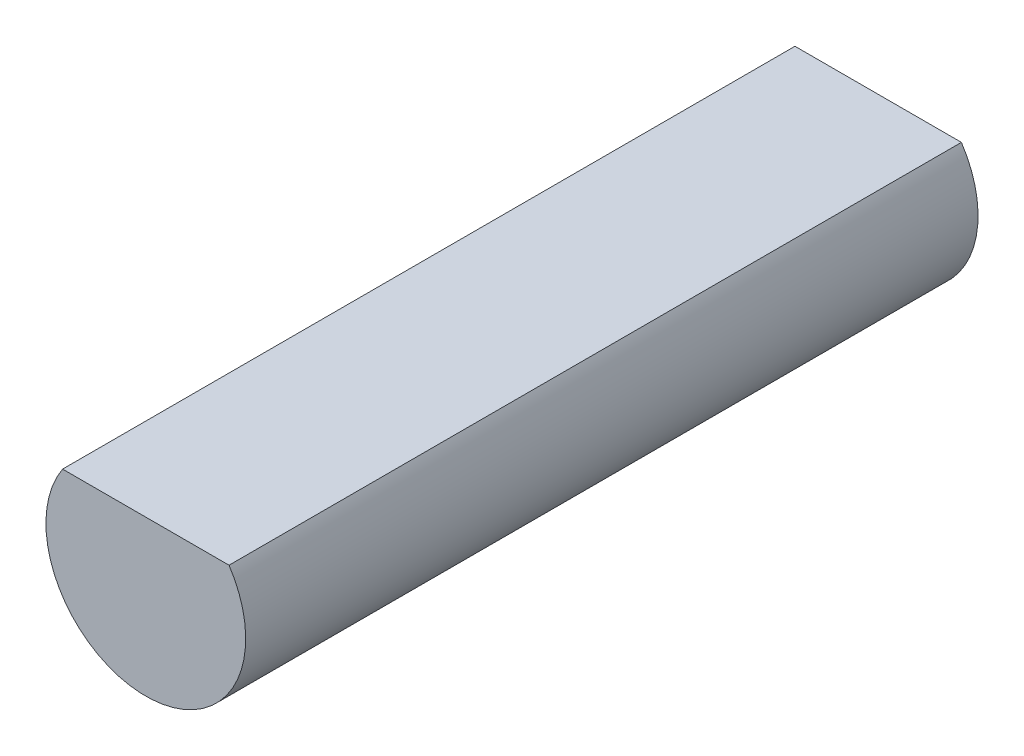
ISO-10303-21;
HEADER;
FILE_DESCRIPTION(('STEP AP214'),'2;1');
FILE_NAME('part.step','',(''),(''),'','','');
FILE_SCHEMA(('AUTOMOTIVE_DESIGN { 1 0 10303 214 1 1 1 1 }'));
ENDSEC;
DATA;
#1=APPLICATION_CONTEXT('core data for automotive mechanical design processes');
#2=APPLICATION_PROTOCOL_DEFINITION('international standard','automotive_design',2000,#1);
#3=PRODUCT_CONTEXT('',#1,'mechanical');
#4=PRODUCT('Part','Part','',(#3));
#5=PRODUCT_RELATED_PRODUCT_CATEGORY('part','',(#4));
#6=PRODUCT_DEFINITION_FORMATION('','',#4);
#7=PRODUCT_DEFINITION_CONTEXT('part definition',#1,'design');
#8=PRODUCT_DEFINITION('design','',#6,#7);
#9=PRODUCT_DEFINITION_SHAPE('','',#8);
#10=(LENGTH_UNIT() NAMED_UNIT(*) SI_UNIT(.MILLI.,.METRE.));
#11=(NAMED_UNIT(*) PLANE_ANGLE_UNIT() SI_UNIT($,.RADIAN.));
#12=(NAMED_UNIT(*) SI_UNIT($,.STERADIAN.) SOLID_ANGLE_UNIT());
#13=UNCERTAINTY_MEASURE_WITH_UNIT(LENGTH_MEASURE(1.E-05),#10,'distance_accuracy_value','');
#14=(GEOMETRIC_REPRESENTATION_CONTEXT(3) GLOBAL_UNCERTAINTY_ASSIGNED_CONTEXT((#13)) GLOBAL_UNIT_ASSIGNED_CONTEXT((#10,
#11,#12)) REPRESENTATION_CONTEXT('',''));
#15=CARTESIAN_POINT('',(0.,0.,0.));
#16=DIRECTION('',(0.,0.,1.));
#17=DIRECTION('',(1.,0.,0.));
#18=AXIS2_PLACEMENT_3D('',#15,#16,#17);
#19=CARTESIAN_POINT('',(0.,1.6583123951777,22.));
#20=DIRECTION('',(0.,1.,0.));
#21=DIRECTION('',(0.,0.,1.));
#22=AXIS2_PLACEMENT_3D('',#19,#20,#21);
#23=PLANE('',#22);
#24=DIRECTION('',(1.,0.,0.));
#25=VECTOR('',#24,1.);
#26=CARTESIAN_POINT('',(0.,1.6583123951777,0.));
#27=LINE('',#26,#25);
#28=CARTESIAN_POINT('',(-2.5,1.6583123951777,0.));
#29=VERTEX_POINT('',#28);
#30=CARTESIAN_POINT('',(2.5,1.6583123951777,0.));
#31=VERTEX_POINT('',#30);
#32=EDGE_CURVE('E63',#29,#31,#27,.T.);
#33=ORIENTED_EDGE('',*,*,#32,.F.);
#34=DIRECTION('',(0.,0.,-1.));
#35=VECTOR('',#34,1.);
#36=CARTESIAN_POINT('',(-2.5,1.6583123951777,22.));
#37=LINE('',#36,#35);
#38=CARTESIAN_POINT('',(-2.5,1.6583123951777,22.));
#39=VERTEX_POINT('',#38);
#40=EDGE_CURVE('E11',#39,#29,#37,.T.);
#41=ORIENTED_EDGE('',*,*,#40,.F.);
#42=DIRECTION('',(1.,0.,0.));
#43=VECTOR('',#42,1.);
#44=CARTESIAN_POINT('',(0.,1.6583123951777,22.));
#45=LINE('',#44,#43);
#46=CARTESIAN_POINT('',(2.5,1.6583123951777,22.));
#47=VERTEX_POINT('',#46);
#48=EDGE_CURVE('E64',#39,#47,#45,.T.);
#49=ORIENTED_EDGE('',*,*,#48,.T.);
#50=DIRECTION('',(0.,0.,-1.));
#51=VECTOR('',#50,1.);
#52=CARTESIAN_POINT('',(2.5,1.6583123951777,22.));
#53=LINE('',#52,#51);
#54=EDGE_CURVE('E43',#47,#31,#53,.T.);
#55=ORIENTED_EDGE('',*,*,#54,.T.);
#56=EDGE_LOOP('',(#33,#41,#49,#55));
#57=FACE_BOUND('',#56,.T.);
#58=ADVANCED_FACE('F35',(#57),#23,.T.);
#59=CARTESIAN_POINT('',(0.,0.,22.));
#60=DIRECTION('',(0.,0.,-1.));
#61=DIRECTION('',(-1.,0.,0.));
#62=AXIS2_PLACEMENT_3D('',#59,#60,#61);
#63=CYLINDRICAL_SURFACE('',#62,3.);
#64=CARTESIAN_POINT('',(0.,0.,0.));
#65=DIRECTION('',(0.,0.,1.));
#66=DIRECTION('',(1.,0.,0.));
#67=AXIS2_PLACEMENT_3D('',#64,#65,#66);
#68=CIRCLE('',#67,3.);
#69=EDGE_CURVE('E65',#29,#31,#68,.T.);
#70=ORIENTED_EDGE('',*,*,#69,.T.);
#71=ORIENTED_EDGE('',*,*,#54,.F.);
#72=CARTESIAN_POINT('',(0.,0.,22.));
#73=DIRECTION('',(0.,0.,1.));
#74=DIRECTION('',(1.,0.,0.));
#75=AXIS2_PLACEMENT_3D('',#72,#73,#74);
#76=CIRCLE('',#75,3.);
#77=EDGE_CURVE('E50',#39,#47,#76,.T.);
#78=ORIENTED_EDGE('',*,*,#77,.F.);
#79=ORIENTED_EDGE('',*,*,#40,.T.);
#80=EDGE_LOOP('',(#70,#71,#78,#79));
#81=FACE_BOUND('',#80,.T.);
#82=ADVANCED_FACE('F66',(#81),#63,.T.);
#83=CARTESIAN_POINT('',(0.,0.,22.));
#84=DIRECTION('',(0.,0.,1.));
#85=DIRECTION('',(1.,0.,0.));
#86=AXIS2_PLACEMENT_3D('',#83,#84,#85);
#87=PLANE('',#86);
#88=ORIENTED_EDGE('',*,*,#48,.F.);
#89=ORIENTED_EDGE('',*,*,#77,.T.);
#90=EDGE_LOOP('',(#88,#89));
#91=FACE_BOUND('',#90,.T.);
#92=ADVANCED_FACE('F74',(#91),#87,.T.);
#93=CARTESIAN_POINT('',(0.,0.,0.));
#94=DIRECTION('',(0.,0.,1.));
#95=DIRECTION('',(1.,0.,0.));
#96=AXIS2_PLACEMENT_3D('',#93,#94,#95);
#97=PLANE('',#96);
#98=ORIENTED_EDGE('',*,*,#32,.T.);
#99=ORIENTED_EDGE('',*,*,#69,.F.);
#100=EDGE_LOOP('',(#98,#99));
#101=FACE_BOUND('',#100,.T.);
#102=ADVANCED_FACE('F69',(#101),#97,.F.);
#103=CLOSED_SHELL('',(#58,#82,#92,#102));
#104=MANIFOLD_SOLID_BREP('B2',#103);
#105=ADVANCED_BREP_SHAPE_REPRESENTATION('',(#18,#104),#14);
#106=SHAPE_DEFINITION_REPRESENTATION(#9,#105);
ENDSEC;
END-ISO-10303-21;
